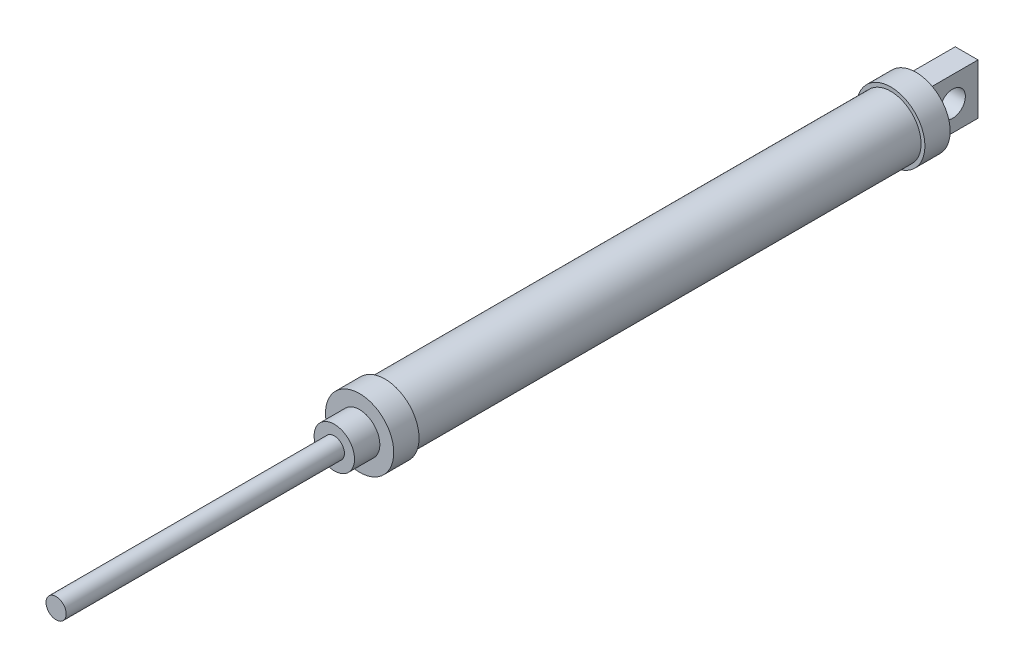
ISO-10303-21;
HEADER;
FILE_DESCRIPTION(('STEP AP214'),'2;1');
FILE_NAME('part.step','',(''),(''),'','','');
FILE_SCHEMA(('AUTOMOTIVE_DESIGN { 1 0 10303 214 1 1 1 1 }'));
ENDSEC;
DATA;
#1=APPLICATION_CONTEXT('core data for automotive mechanical design processes');
#2=APPLICATION_PROTOCOL_DEFINITION('international standard','automotive_design',2000,#1);
#3=PRODUCT_CONTEXT('',#1,'mechanical');
#4=PRODUCT('Part','Part','',(#3));
#5=PRODUCT_RELATED_PRODUCT_CATEGORY('part','',(#4));
#6=PRODUCT_DEFINITION_FORMATION('','',#4);
#7=PRODUCT_DEFINITION_CONTEXT('part definition',#1,'design');
#8=PRODUCT_DEFINITION('design','',#6,#7);
#9=PRODUCT_DEFINITION_SHAPE('','',#8);
#10=(LENGTH_UNIT() NAMED_UNIT(*) SI_UNIT(.MILLI.,.METRE.));
#11=(NAMED_UNIT(*) PLANE_ANGLE_UNIT() SI_UNIT($,.RADIAN.));
#12=(NAMED_UNIT(*) SI_UNIT($,.STERADIAN.) SOLID_ANGLE_UNIT());
#13=UNCERTAINTY_MEASURE_WITH_UNIT(LENGTH_MEASURE(1.E-05),#10,'distance_accuracy_value','');
#14=(GEOMETRIC_REPRESENTATION_CONTEXT(3) GLOBAL_UNCERTAINTY_ASSIGNED_CONTEXT((#13)) GLOBAL_UNIT_ASSIGNED_CONTEXT((#10,
#11,#12)) REPRESENTATION_CONTEXT('',''));
#15=CARTESIAN_POINT('',(0.,0.,0.));
#16=DIRECTION('',(0.,0.,1.));
#17=DIRECTION('',(1.,0.,0.));
#18=AXIS2_PLACEMENT_3D('',#15,#16,#17);
#19=CARTESIAN_POINT('',(0.,0.,10.));
#20=DIRECTION('',(0.,0.,-1.));
#21=DIRECTION('',(-1.,0.,0.));
#22=AXIS2_PLACEMENT_3D('',#19,#20,#21);
#23=CYLINDRICAL_SURFACE('',#22,13.5);
#24=CARTESIAN_POINT('',(0.,0.,10.));
#25=DIRECTION('',(0.,0.,1.));
#26=DIRECTION('',(1.,0.,0.));
#27=AXIS2_PLACEMENT_3D('',#24,#25,#26);
#28=CIRCLE('',#27,13.5);
#29=CARTESIAN_POINT('',(13.5,0.,10.));
#30=VERTEX_POINT('',#29);
#31=EDGE_CURVE('E120',#30,#30,#28,.T.);
#32=ORIENTED_EDGE('',*,*,#31,.F.);
#33=EDGE_LOOP('',(#32));
#34=FACE_BOUND('',#33,.T.);
#35=CARTESIAN_POINT('',(0.,0.,0.));
#36=DIRECTION('',(0.,0.,1.));
#37=DIRECTION('',(1.,0.,0.));
#38=AXIS2_PLACEMENT_3D('',#35,#36,#37);
#39=CIRCLE('',#38,13.5);
#40=CARTESIAN_POINT('',(13.5,0.,0.));
#41=VERTEX_POINT('',#40);
#42=EDGE_CURVE('E117',#41,#41,#39,.T.);
#43=ORIENTED_EDGE('',*,*,#42,.T.);
#44=EDGE_LOOP('',(#43));
#45=FACE_BOUND('',#44,.T.);
#46=ADVANCED_FACE('F35',(#34,#45),#23,.T.);
#47=CARTESIAN_POINT('',(0.,0.,10.));
#48=DIRECTION('',(0.,0.,1.));
#49=DIRECTION('',(1.,0.,0.));
#50=AXIS2_PLACEMENT_3D('',#47,#48,#49);
#51=PLANE('',#50);
#52=CARTESIAN_POINT('',(0.,0.,10.));
#53=DIRECTION('',(0.,0.,1.));
#54=DIRECTION('',(1.,0.,0.));
#55=AXIS2_PLACEMENT_3D('',#52,#53,#54);
#56=CIRCLE('',#55,8.);
#57=CARTESIAN_POINT('',(8.,0.,10.));
#58=VERTEX_POINT('',#57);
#59=EDGE_CURVE('E114',#58,#58,#56,.T.);
#60=ORIENTED_EDGE('',*,*,#59,.F.);
#61=EDGE_LOOP('',(#60));
#62=FACE_BOUND('',#61,.T.);
#63=ORIENTED_EDGE('',*,*,#31,.T.);
#64=EDGE_LOOP('',(#63));
#65=FACE_BOUND('',#64,.T.);
#66=ADVANCED_FACE('F129',(#62,#65),#51,.T.);
#67=CARTESIAN_POINT('',(0.,0.,0.));
#68=DIRECTION('',(0.,0.,1.));
#69=DIRECTION('',(1.,0.,0.));
#70=AXIS2_PLACEMENT_3D('',#67,#68,#69);
#71=PLANE('',#70);
#72=CARTESIAN_POINT('',(0.,0.,0.));
#73=DIRECTION('',(0.,0.,-1.));
#74=DIRECTION('',(-1.,0.,0.));
#75=AXIS2_PLACEMENT_3D('',#72,#73,#74);
#76=CIRCLE('',#75,12.);
#77=CARTESIAN_POINT('',(-12.,0.,0.));
#78=VERTEX_POINT('',#77);
#79=EDGE_CURVE('E43',#78,#78,#76,.T.);
#80=ORIENTED_EDGE('',*,*,#79,.F.);
#81=EDGE_LOOP('',(#80));
#82=FACE_BOUND('',#81,.T.);
#83=ORIENTED_EDGE('',*,*,#42,.F.);
#84=EDGE_LOOP('',(#83));
#85=FACE_BOUND('',#84,.T.);
#86=ADVANCED_FACE('F126',(#82,#85),#71,.F.);
#87=CARTESIAN_POINT('',(0.,0.,20.));
#88=DIRECTION('',(0.,0.,-1.));
#89=DIRECTION('',(-1.,0.,0.));
#90=AXIS2_PLACEMENT_3D('',#87,#88,#89);
#91=CYLINDRICAL_SURFACE('',#90,8.);
#92=CARTESIAN_POINT('',(0.,0.,20.));
#93=DIRECTION('',(0.,0.,1.));
#94=DIRECTION('',(1.,0.,0.));
#95=AXIS2_PLACEMENT_3D('',#92,#93,#94);
#96=CIRCLE('',#95,8.);
#97=CARTESIAN_POINT('',(8.,0.,20.));
#98=VERTEX_POINT('',#97);
#99=EDGE_CURVE('E111',#98,#98,#96,.T.);
#100=ORIENTED_EDGE('',*,*,#99,.F.);
#101=EDGE_LOOP('',(#100));
#102=FACE_BOUND('',#101,.T.);
#103=ORIENTED_EDGE('',*,*,#59,.T.);
#104=EDGE_LOOP('',(#103));
#105=FACE_BOUND('',#104,.T.);
#106=ADVANCED_FACE('F128',(#102,#105),#91,.T.);
#107=CARTESIAN_POINT('',(0.,0.,20.));
#108=DIRECTION('',(0.,0.,1.));
#109=DIRECTION('',(1.,0.,0.));
#110=AXIS2_PLACEMENT_3D('',#107,#108,#109);
#111=PLANE('',#110);
#112=CARTESIAN_POINT('',(0.,0.,20.));
#113=DIRECTION('',(0.,0.,1.));
#114=DIRECTION('',(1.,0.,0.));
#115=AXIS2_PLACEMENT_3D('',#112,#113,#114);
#116=CIRCLE('',#115,4.);
#117=CARTESIAN_POINT('',(4.,0.,20.));
#118=VERTEX_POINT('',#117);
#119=EDGE_CURVE('E11',#118,#118,#116,.T.);
#120=ORIENTED_EDGE('',*,*,#119,.F.);
#121=EDGE_LOOP('',(#120));
#122=FACE_BOUND('',#121,.T.);
#123=ORIENTED_EDGE('',*,*,#99,.T.);
#124=EDGE_LOOP('',(#123));
#125=FACE_BOUND('',#124,.T.);
#126=ADVANCED_FACE('F135',(#122,#125),#111,.T.);
#127=CARTESIAN_POINT('',(0.,0.,-200.));
#128=DIRECTION('',(0.,0.,1.));
#129=DIRECTION('',(1.,0.,0.));
#130=AXIS2_PLACEMENT_3D('',#127,#128,#129);
#131=CYLINDRICAL_SURFACE('',#130,12.);
#132=CARTESIAN_POINT('',(0.,0.,-200.));
#133=DIRECTION('',(0.,0.,-1.));
#134=DIRECTION('',(-1.,0.,0.));
#135=AXIS2_PLACEMENT_3D('',#132,#133,#134);
#136=CIRCLE('',#135,12.);
#137=CARTESIAN_POINT('',(-12.,0.,-200.));
#138=VERTEX_POINT('',#137);
#139=EDGE_CURVE('E107',#138,#138,#136,.T.);
#140=ORIENTED_EDGE('',*,*,#139,.F.);
#141=EDGE_LOOP('',(#140));
#142=FACE_BOUND('',#141,.T.);
#143=ORIENTED_EDGE('',*,*,#79,.T.);
#144=EDGE_LOOP('',(#143));
#145=FACE_BOUND('',#144,.T.);
#146=ADVANCED_FACE('F168',(#142,#145),#131,.T.);
#147=CARTESIAN_POINT('',(0.,0.,-210.));
#148=DIRECTION('',(0.,0.,1.));
#149=DIRECTION('',(1.,0.,0.));
#150=AXIS2_PLACEMENT_3D('',#147,#148,#149);
#151=CYLINDRICAL_SURFACE('',#150,13.5);
#152=CARTESIAN_POINT('',(0.,0.,-210.));
#153=DIRECTION('',(0.,0.,-1.));
#154=DIRECTION('',(-1.,0.,0.));
#155=AXIS2_PLACEMENT_3D('',#152,#153,#154);
#156=CIRCLE('',#155,13.5);
#157=CARTESIAN_POINT('',(-13.5,0.,-210.));
#158=VERTEX_POINT('',#157);
#159=EDGE_CURVE('E100',#158,#158,#156,.T.);
#160=ORIENTED_EDGE('',*,*,#159,.F.);
#161=EDGE_LOOP('',(#160));
#162=FACE_BOUND('',#161,.T.);
#163=CARTESIAN_POINT('',(0.,0.,-200.));
#164=DIRECTION('',(0.,0.,-1.));
#165=DIRECTION('',(-1.,0.,0.));
#166=AXIS2_PLACEMENT_3D('',#163,#164,#165);
#167=CIRCLE('',#166,13.5);
#168=CARTESIAN_POINT('',(-13.5,0.,-200.));
#169=VERTEX_POINT('',#168);
#170=EDGE_CURVE('E97',#169,#169,#167,.T.);
#171=ORIENTED_EDGE('',*,*,#170,.T.);
#172=EDGE_LOOP('',(#171));
#173=FACE_BOUND('',#172,.T.);
#174=ADVANCED_FACE('F173',(#162,#173),#151,.T.);
#175=CARTESIAN_POINT('',(0.,0.,-210.));
#176=DIRECTION('',(0.,0.,-1.));
#177=DIRECTION('',(-1.,0.,0.));
#178=AXIS2_PLACEMENT_3D('',#175,#176,#177);
#179=PLANE('',#178);
#180=DIRECTION('',(0.,-1.,0.));
#181=VECTOR('',#180,1.);
#182=CARTESIAN_POINT('',(4.5,-10.,-210.));
#183=LINE('',#182,#181);
#184=CARTESIAN_POINT('',(4.5,10.,-210.));
#185=VERTEX_POINT('',#184);
#186=CARTESIAN_POINT('',(4.5,-10.,-210.));
#187=VERTEX_POINT('',#186);
#188=EDGE_CURVE('E51',#185,#187,#183,.T.);
#189=ORIENTED_EDGE('',*,*,#188,.F.);
#190=DIRECTION('',(1.,0.,0.));
#191=VECTOR('',#190,1.);
#192=CARTESIAN_POINT('',(-4.5,10.,-210.));
#193=LINE('',#192,#191);
#194=CARTESIAN_POINT('',(-4.5,10.,-210.));
#195=VERTEX_POINT('',#194);
#196=EDGE_CURVE('E55',#195,#185,#193,.T.);
#197=ORIENTED_EDGE('',*,*,#196,.F.);
#198=DIRECTION('',(0.,1.,0.));
#199=VECTOR('',#198,1.);
#200=CARTESIAN_POINT('',(-4.5,-10.,-210.));
#201=LINE('',#200,#199);
#202=CARTESIAN_POINT('',(-4.5,-10.,-210.));
#203=VERTEX_POINT('',#202);
#204=EDGE_CURVE('E302',#203,#195,#201,.T.);
#205=ORIENTED_EDGE('',*,*,#204,.F.);
#206=DIRECTION('',(-1.,0.,0.));
#207=VECTOR('',#206,1.);
#208=CARTESIAN_POINT('',(-4.5,-10.,-210.));
#209=LINE('',#208,#207);
#210=EDGE_CURVE('E300',#187,#203,#209,.T.);
#211=ORIENTED_EDGE('',*,*,#210,.F.);
#212=EDGE_LOOP('',(#189,#197,#205,#211));
#213=FACE_BOUND('',#212,.T.);
#214=ORIENTED_EDGE('',*,*,#159,.T.);
#215=EDGE_LOOP('',(#214));
#216=FACE_BOUND('',#215,.T.);
#217=ADVANCED_FACE('F183',(#213,#216),#179,.T.);
#218=CARTESIAN_POINT('',(0.,0.,-200.));
#219=DIRECTION('',(0.,0.,-1.));
#220=DIRECTION('',(-1.,0.,0.));
#221=AXIS2_PLACEMENT_3D('',#218,#219,#220);
#222=PLANE('',#221);
#223=ORIENTED_EDGE('',*,*,#139,.T.);
#224=EDGE_LOOP('',(#223));
#225=FACE_BOUND('',#224,.T.);
#226=ORIENTED_EDGE('',*,*,#170,.F.);
#227=EDGE_LOOP('',(#226));
#228=FACE_BOUND('',#227,.T.);
#229=ADVANCED_FACE('F191',(#225,#228),#222,.F.);
#230=CARTESIAN_POINT('',(4.5,-10.,-230.));
#231=DIRECTION('',(-1.,0.,0.));
#232=DIRECTION('',(0.,-1.,0.));
#233=AXIS2_PLACEMENT_3D('',#230,#231,#232);
#234=PLANE('',#233);
#235=CARTESIAN_POINT('',(4.5,0.,-220.));
#236=DIRECTION('',(1.,0.,0.));
#237=DIRECTION('',(0.,1.,0.));
#238=AXIS2_PLACEMENT_3D('',#235,#236,#237);
#239=CIRCLE('',#238,4.99999999999999);
#240=CARTESIAN_POINT('',(4.5,4.99999999999999,-220.));
#241=VERTEX_POINT('',#240);
#242=EDGE_CURVE('E291',#241,#241,#239,.T.);
#243=ORIENTED_EDGE('',*,*,#242,.F.);
#244=EDGE_LOOP('',(#243));
#245=FACE_BOUND('',#244,.T.);
#246=ORIENTED_EDGE('',*,*,#188,.T.);
#247=DIRECTION('',(0.,0.,1.));
#248=VECTOR('',#247,1.);
#249=CARTESIAN_POINT('',(4.5,-10.,-230.));
#250=LINE('',#249,#248);
#251=CARTESIAN_POINT('',(4.5,-10.,-230.));
#252=VERTEX_POINT('',#251);
#253=EDGE_CURVE('E80',#252,#187,#250,.T.);
#254=ORIENTED_EDGE('',*,*,#253,.F.);
#255=DIRECTION('',(0.,-1.,0.));
#256=VECTOR('',#255,1.);
#257=CARTESIAN_POINT('',(4.5,-10.,-230.));
#258=LINE('',#257,#256);
#259=CARTESIAN_POINT('',(4.5,10.,-230.));
#260=VERTEX_POINT('',#259);
#261=EDGE_CURVE('E86',#260,#252,#258,.T.);
#262=ORIENTED_EDGE('',*,*,#261,.F.);
#263=DIRECTION('',(0.,0.,1.));
#264=VECTOR('',#263,1.);
#265=CARTESIAN_POINT('',(4.5,10.,-230.));
#266=LINE('',#265,#264);
#267=EDGE_CURVE('E298',#260,#185,#266,.T.);
#268=ORIENTED_EDGE('',*,*,#267,.T.);
#269=EDGE_LOOP('',(#246,#254,#262,#268));
#270=FACE_BOUND('',#269,.T.);
#271=ADVANCED_FACE('F96',(#245,#270),#234,.F.);
#272=CARTESIAN_POINT('',(-4.5,-10.,-230.));
#273=DIRECTION('',(0.,1.,0.));
#274=DIRECTION('',(-1.,0.,0.));
#275=AXIS2_PLACEMENT_3D('',#272,#273,#274);
#276=PLANE('',#275);
#277=ORIENTED_EDGE('',*,*,#210,.T.);
#278=DIRECTION('',(0.,0.,1.));
#279=VECTOR('',#278,1.);
#280=CARTESIAN_POINT('',(-4.5,-10.,-230.));
#281=LINE('',#280,#279);
#282=CARTESIAN_POINT('',(-4.5,-10.,-230.));
#283=VERTEX_POINT('',#282);
#284=EDGE_CURVE('E82',#283,#203,#281,.T.);
#285=ORIENTED_EDGE('',*,*,#284,.F.);
#286=DIRECTION('',(-1.,0.,0.));
#287=VECTOR('',#286,1.);
#288=CARTESIAN_POINT('',(-4.5,-10.,-230.));
#289=LINE('',#288,#287);
#290=EDGE_CURVE('E75',#252,#283,#289,.T.);
#291=ORIENTED_EDGE('',*,*,#290,.F.);
#292=ORIENTED_EDGE('',*,*,#253,.T.);
#293=EDGE_LOOP('',(#277,#285,#291,#292));
#294=FACE_BOUND('',#293,.T.);
#295=ADVANCED_FACE('F78',(#294),#276,.F.);
#296=CARTESIAN_POINT('',(-4.5,-10.,-230.));
#297=DIRECTION('',(1.,0.,0.));
#298=DIRECTION('',(0.,0.,-1.));
#299=AXIS2_PLACEMENT_3D('',#296,#297,#298);
#300=PLANE('',#299);
#301=CARTESIAN_POINT('',(-4.5,0.,-220.));
#302=DIRECTION('',(1.,0.,0.));
#303=DIRECTION('',(0.,0.,-1.));
#304=AXIS2_PLACEMENT_3D('',#301,#302,#303);
#305=CIRCLE('',#304,4.99999999999999);
#306=CARTESIAN_POINT('',(-4.5,0.,-225.));
#307=VERTEX_POINT('',#306);
#308=EDGE_CURVE('E38',#307,#307,#305,.T.);
#309=ORIENTED_EDGE('',*,*,#308,.T.);
#310=EDGE_LOOP('',(#309));
#311=FACE_BOUND('',#310,.T.);
#312=ORIENTED_EDGE('',*,*,#204,.T.);
#313=DIRECTION('',(0.,0.,1.));
#314=VECTOR('',#313,1.);
#315=CARTESIAN_POINT('',(-4.5,10.,-230.));
#316=LINE('',#315,#314);
#317=CARTESIAN_POINT('',(-4.5,10.,-230.));
#318=VERTEX_POINT('',#317);
#319=EDGE_CURVE('E102',#318,#195,#316,.T.);
#320=ORIENTED_EDGE('',*,*,#319,.F.);
#321=DIRECTION('',(0.,1.,0.));
#322=VECTOR('',#321,1.);
#323=CARTESIAN_POINT('',(-4.5,-10.,-230.));
#324=LINE('',#323,#322);
#325=EDGE_CURVE('E85',#283,#318,#324,.T.);
#326=ORIENTED_EDGE('',*,*,#325,.F.);
#327=ORIENTED_EDGE('',*,*,#284,.T.);
#328=EDGE_LOOP('',(#312,#320,#326,#327));
#329=FACE_BOUND('',#328,.T.);
#330=ADVANCED_FACE('F213',(#311,#329),#300,.F.);
#331=CARTESIAN_POINT('',(-4.5,10.,-230.));
#332=DIRECTION('',(0.,-1.,0.));
#333=DIRECTION('',(0.,0.,-1.));
#334=AXIS2_PLACEMENT_3D('',#331,#332,#333);
#335=PLANE('',#334);
#336=ORIENTED_EDGE('',*,*,#196,.T.);
#337=ORIENTED_EDGE('',*,*,#267,.F.);
#338=DIRECTION('',(1.,0.,0.));
#339=VECTOR('',#338,1.);
#340=CARTESIAN_POINT('',(-4.5,10.,-230.));
#341=LINE('',#340,#339);
#342=EDGE_CURVE('E91',#318,#260,#341,.T.);
#343=ORIENTED_EDGE('',*,*,#342,.F.);
#344=ORIENTED_EDGE('',*,*,#319,.T.);
#345=EDGE_LOOP('',(#336,#337,#343,#344));
#346=FACE_BOUND('',#345,.T.);
#347=ADVANCED_FACE('F220',(#346),#335,.F.);
#348=CARTESIAN_POINT('',(0.,0.,-230.));
#349=DIRECTION('',(0.,0.,-1.));
#350=DIRECTION('',(-1.,0.,0.));
#351=AXIS2_PLACEMENT_3D('',#348,#349,#350);
#352=PLANE('',#351);
#353=ORIENTED_EDGE('',*,*,#261,.T.);
#354=ORIENTED_EDGE('',*,*,#290,.T.);
#355=ORIENTED_EDGE('',*,*,#325,.T.);
#356=ORIENTED_EDGE('',*,*,#342,.T.);
#357=EDGE_LOOP('',(#353,#354,#355,#356));
#358=FACE_BOUND('',#357,.T.);
#359=ADVANCED_FACE('F89',(#358),#352,.T.);
#360=CARTESIAN_POINT('',(-15.5,0.,-220.));
#361=DIRECTION('',(1.,0.,0.));
#362=DIRECTION('',(0.,1.,0.));
#363=AXIS2_PLACEMENT_3D('',#360,#361,#362);
#364=CYLINDRICAL_SURFACE('',#363,4.99999999999999);
#365=ORIENTED_EDGE('',*,*,#242,.T.);
#366=EDGE_LOOP('',(#365));
#367=FACE_BOUND('',#366,.T.);
#368=ORIENTED_EDGE('',*,*,#308,.F.);
#369=EDGE_LOOP('',(#368));
#370=FACE_BOUND('',#369,.T.);
#371=ADVANCED_FACE('F234',(#367,#370),#364,.F.);
#372=CARTESIAN_POINT('',(0.,0.,130.));
#373=DIRECTION('',(0.,0.,-1.));
#374=DIRECTION('',(-1.,0.,0.));
#375=AXIS2_PLACEMENT_3D('',#372,#373,#374);
#376=CYLINDRICAL_SURFACE('',#375,4.);
#377=CARTESIAN_POINT('',(0.,0.,130.));
#378=DIRECTION('',(0.,0.,1.));
#379=DIRECTION('',(1.,0.,0.));
#380=AXIS2_PLACEMENT_3D('',#377,#378,#379);
#381=CIRCLE('',#380,4.);
#382=CARTESIAN_POINT('',(4.,0.,130.));
#383=VERTEX_POINT('',#382);
#384=EDGE_CURVE('E290',#383,#383,#381,.T.);
#385=ORIENTED_EDGE('',*,*,#384,.F.);
#386=EDGE_LOOP('',(#385));
#387=FACE_BOUND('',#386,.T.);
#388=ORIENTED_EDGE('',*,*,#119,.T.);
#389=EDGE_LOOP('',(#388));
#390=FACE_BOUND('',#389,.T.);
#391=ADVANCED_FACE('F257',(#387,#390),#376,.T.);
#392=CARTESIAN_POINT('',(0.,0.,130.));
#393=DIRECTION('',(0.,0.,1.));
#394=DIRECTION('',(1.,0.,0.));
#395=AXIS2_PLACEMENT_3D('',#392,#393,#394);
#396=PLANE('',#395);
#397=ORIENTED_EDGE('',*,*,#384,.T.);
#398=EDGE_LOOP('',(#397));
#399=FACE_BOUND('',#398,.T.);
#400=ADVANCED_FACE('F274',(#399),#396,.T.);
#401=CLOSED_SHELL('',(#46,#66,#86,#106,#126,#146,#174,#217,#229,#271,#295,#330,#347,#359,#371,
#391,#400));
#402=MANIFOLD_SOLID_BREP('B2',#401);
#403=ADVANCED_BREP_SHAPE_REPRESENTATION('',(#18,#402),#14);
#404=SHAPE_DEFINITION_REPRESENTATION(#9,#403);
ENDSEC;
END-ISO-10303-21;
